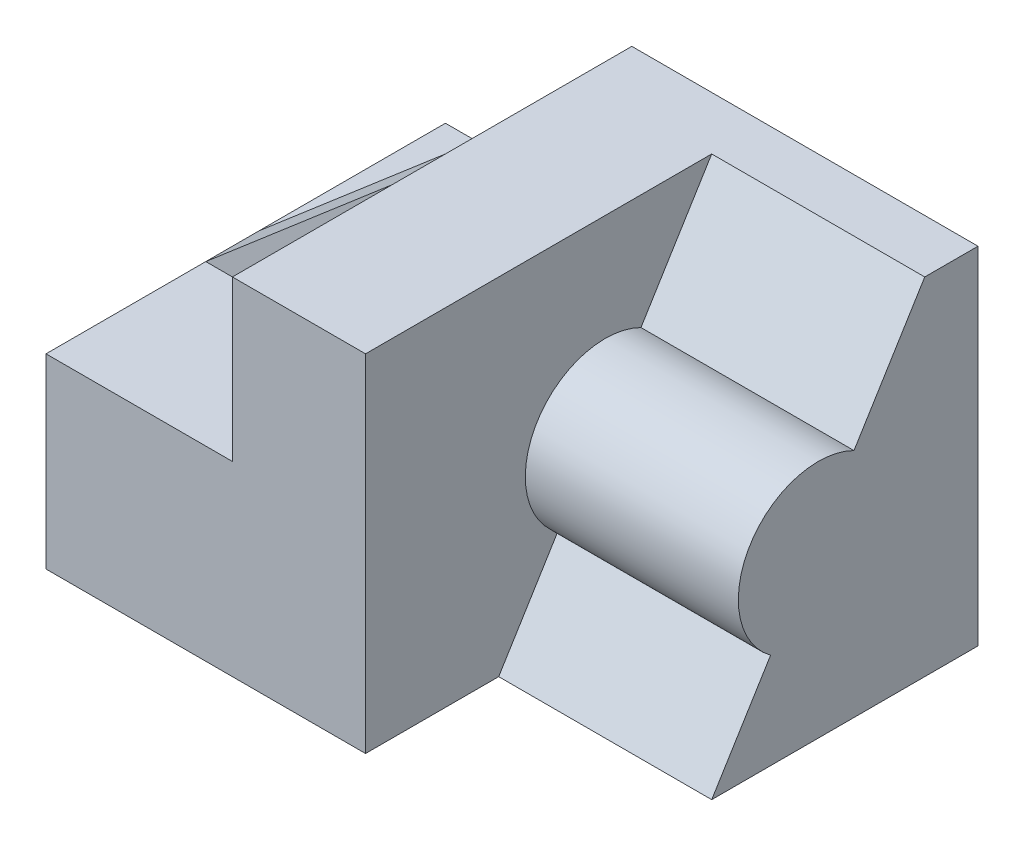
ISO-10303-21;
HEADER;
FILE_DESCRIPTION(('STEP AP214'),'2;1');
FILE_NAME('part.step','',(''),(''),'','','');
FILE_SCHEMA(('AUTOMOTIVE_DESIGN { 1 0 10303 214 1 1 1 1 }'));
ENDSEC;
DATA;
#1=APPLICATION_CONTEXT('core data for automotive mechanical design processes');
#2=APPLICATION_PROTOCOL_DEFINITION('international standard','automotive_design',2000,#1);
#3=PRODUCT_CONTEXT('',#1,'mechanical');
#4=PRODUCT('Part','Part','',(#3));
#5=PRODUCT_RELATED_PRODUCT_CATEGORY('part','',(#4));
#6=PRODUCT_DEFINITION_FORMATION('','',#4);
#7=PRODUCT_DEFINITION_CONTEXT('part definition',#1,'design');
#8=PRODUCT_DEFINITION('design','',#6,#7);
#9=PRODUCT_DEFINITION_SHAPE('','',#8);
#10=(LENGTH_UNIT() NAMED_UNIT(*) SI_UNIT(.MILLI.,.METRE.));
#11=(NAMED_UNIT(*) PLANE_ANGLE_UNIT() SI_UNIT($,.RADIAN.));
#12=(NAMED_UNIT(*) SI_UNIT($,.STERADIAN.) SOLID_ANGLE_UNIT());
#13=UNCERTAINTY_MEASURE_WITH_UNIT(LENGTH_MEASURE(1.E-05),#10,'distance_accuracy_value','');
#14=(GEOMETRIC_REPRESENTATION_CONTEXT(3) GLOBAL_UNCERTAINTY_ASSIGNED_CONTEXT((#13)) GLOBAL_UNIT_ASSIGNED_CONTEXT((#10,
#11,#12)) REPRESENTATION_CONTEXT('',''));
#15=CARTESIAN_POINT('',(0.,0.,0.));
#16=DIRECTION('',(0.,0.,1.));
#17=DIRECTION('',(1.,0.,0.));
#18=AXIS2_PLACEMENT_3D('',#15,#16,#17);
#19=CARTESIAN_POINT('',(-25.,35.,-75.));
#20=DIRECTION('',(0.,1.,0.));
#21=DIRECTION('',(0.,0.,1.));
#22=AXIS2_PLACEMENT_3D('',#19,#20,#21);
#23=PLANE('',#22);
#24=DIRECTION('',(0.,0.,1.));
#25=VECTOR('',#24,1.);
#26=CARTESIAN_POINT('',(-60.,35.,-75.));
#27=LINE('',#26,#25);
#28=CARTESIAN_POINT('',(-60.,35.,-75.));
#29=VERTEX_POINT('',#28);
#30=CARTESIAN_POINT('',(-60.,35.,-40.));
#31=VERTEX_POINT('',#30);
#32=EDGE_CURVE('E42',#29,#31,#27,.T.);
#33=ORIENTED_EDGE('',*,*,#32,.T.);
#34=DIRECTION('',(1.,0.,0.));
#35=VECTOR('',#34,1.);
#36=CARTESIAN_POINT('',(-60.,35.,-40.));
#37=LINE('',#36,#35);
#38=CARTESIAN_POINT('',(-25.,35.,-40.));
#39=VERTEX_POINT('',#38);
#40=EDGE_CURVE('E64',#31,#39,#37,.T.);
#41=ORIENTED_EDGE('',*,*,#40,.T.);
#42=DIRECTION('',(0.,0.,1.));
#43=VECTOR('',#42,1.);
#44=CARTESIAN_POINT('',(-25.,35.,-75.));
#45=LINE('',#44,#43);
#46=CARTESIAN_POINT('',(-25.,35.,-75.));
#47=VERTEX_POINT('',#46);
#48=EDGE_CURVE('E11',#47,#39,#45,.T.);
#49=ORIENTED_EDGE('',*,*,#48,.F.);
#50=DIRECTION('',(-1.,0.,0.));
#51=VECTOR('',#50,1.);
#52=CARTESIAN_POINT('',(-25.,35.,-75.));
#53=LINE('',#52,#51);
#54=EDGE_CURVE('E231',#47,#29,#53,.T.);
#55=ORIENTED_EDGE('',*,*,#54,.T.);
#56=EDGE_LOOP('',(#33,#41,#49,#55));
#57=FACE_BOUND('',#56,.T.);
#58=ADVANCED_FACE('F39',(#57),#23,.T.);
#59=CARTESIAN_POINT('',(-25.,35.,-30.));
#60=VERTEX_POINT('',#59);
#61=CARTESIAN_POINT('',(-25.,35.,0.));
#62=VERTEX_POINT('',#61);
#63=EDGE_CURVE('E48',#60,#62,#45,.T.);
#64=ORIENTED_EDGE('',*,*,#63,.F.);
#65=DIRECTION('',(1.,0.,0.));
#66=VECTOR('',#65,1.);
#67=CARTESIAN_POINT('',(-60.,35.,-30.));
#68=LINE('',#67,#66);
#69=CARTESIAN_POINT('',(-60.,35.,-30.));
#70=VERTEX_POINT('',#69);
#71=EDGE_CURVE('E169',#70,#60,#68,.T.);
#72=ORIENTED_EDGE('',*,*,#71,.F.);
#73=CARTESIAN_POINT('',(-60.,35.,0.));
#74=VERTEX_POINT('',#73);
#75=EDGE_CURVE('E249',#70,#74,#27,.T.);
#76=ORIENTED_EDGE('',*,*,#75,.T.);
#77=DIRECTION('',(-1.,0.,0.));
#78=VECTOR('',#77,1.);
#79=CARTESIAN_POINT('',(-25.,35.,0.));
#80=LINE('',#79,#78);
#81=EDGE_CURVE('E230',#62,#74,#80,.T.);
#82=ORIENTED_EDGE('',*,*,#81,.F.);
#83=EDGE_LOOP('',(#64,#72,#76,#82));
#84=FACE_BOUND('',#83,.T.);
#85=ADVANCED_FACE('F284',(#84),#23,.T.);
#86=CARTESIAN_POINT('',(-25.,65.,-75.));
#87=DIRECTION('',(-1.,0.,0.));
#88=DIRECTION('',(0.,-1.,0.));
#89=AXIS2_PLACEMENT_3D('',#86,#87,#88);
#90=PLANE('',#89);
#91=ORIENTED_EDGE('',*,*,#48,.T.);
#92=DIRECTION('',(0.,-1.,0.));
#93=VECTOR('',#92,1.);
#94=CARTESIAN_POINT('',(-25.,65.,-40.));
#95=LINE('',#94,#93);
#96=CARTESIAN_POINT('',(-25.,65.,-40.));
#97=VERTEX_POINT('',#96);
#98=EDGE_CURVE('E158',#97,#39,#95,.T.);
#99=ORIENTED_EDGE('',*,*,#98,.F.);
#100=DIRECTION('',(0.,0.,1.));
#101=VECTOR('',#100,1.);
#102=CARTESIAN_POINT('',(-25.,65.,-75.));
#103=LINE('',#102,#101);
#104=CARTESIAN_POINT('',(-25.,65.,-75.));
#105=VERTEX_POINT('',#104);
#106=EDGE_CURVE('E156',#105,#97,#103,.T.);
#107=ORIENTED_EDGE('',*,*,#106,.F.);
#108=DIRECTION('',(0.,-1.,0.));
#109=VECTOR('',#108,1.);
#110=CARTESIAN_POINT('',(-25.,65.,-75.));
#111=LINE('',#110,#109);
#112=EDGE_CURVE('E245',#105,#47,#111,.T.);
#113=ORIENTED_EDGE('',*,*,#112,.T.);
#114=EDGE_LOOP('',(#91,#99,#107,#113));
#115=FACE_BOUND('',#114,.T.);
#116=ADVANCED_FACE('F306',(#115),#90,.T.);
#117=CARTESIAN_POINT('',(-25.,65.,-30.));
#118=VERTEX_POINT('',#117);
#119=CARTESIAN_POINT('',(-25.,65.,0.));
#120=VERTEX_POINT('',#119);
#121=EDGE_CURVE('E153',#118,#120,#103,.T.);
#122=ORIENTED_EDGE('',*,*,#121,.F.);
#123=DIRECTION('',(0.,1.,0.));
#124=VECTOR('',#123,1.);
#125=CARTESIAN_POINT('',(-25.,35.,-30.));
#126=LINE('',#125,#124);
#127=EDGE_CURVE('E56',#60,#118,#126,.T.);
#128=ORIENTED_EDGE('',*,*,#127,.F.);
#129=ORIENTED_EDGE('',*,*,#63,.T.);
#130=DIRECTION('',(0.,-1.,0.));
#131=VECTOR('',#130,1.);
#132=CARTESIAN_POINT('',(-25.,65.,0.));
#133=LINE('',#132,#131);
#134=EDGE_CURVE('E163',#120,#62,#133,.T.);
#135=ORIENTED_EDGE('',*,*,#134,.F.);
#136=EDGE_LOOP('',(#122,#128,#129,#135));
#137=FACE_BOUND('',#136,.T.);
#138=ADVANCED_FACE('F161',(#137),#90,.T.);
#139=CARTESIAN_POINT('',(0.,65.,-75.));
#140=DIRECTION('',(0.,1.,0.));
#141=DIRECTION('',(0.,0.,1.));
#142=AXIS2_PLACEMENT_3D('',#139,#140,#141);
#143=PLANE('',#142);
#144=DIRECTION('',(0.,0.,1.));
#145=VECTOR('',#144,1.);
#146=CARTESIAN_POINT('',(-25.,65.,-75.001));
#147=LINE('',#146,#145);
#148=EDGE_CURVE('E139',#97,#118,#147,.T.);
#149=ORIENTED_EDGE('',*,*,#148,.T.);
#150=ORIENTED_EDGE('',*,*,#121,.T.);
#151=DIRECTION('',(-1.,0.,0.));
#152=VECTOR('',#151,1.);
#153=CARTESIAN_POINT('',(0.,65.,0.));
#154=LINE('',#153,#152);
#155=CARTESIAN_POINT('',(0.,65.,0.));
#156=VERTEX_POINT('',#155);
#157=EDGE_CURVE('E265',#156,#120,#154,.T.);
#158=ORIENTED_EDGE('',*,*,#157,.F.);
#159=DIRECTION('',(0.,0.,1.));
#160=VECTOR('',#159,1.);
#161=CARTESIAN_POINT('',(0.,65.,-75.));
#162=LINE('',#161,#160);
#163=CARTESIAN_POINT('',(0.,65.,-65.));
#164=VERTEX_POINT('',#163);
#165=EDGE_CURVE('E165',#164,#156,#162,.T.);
#166=ORIENTED_EDGE('',*,*,#165,.F.);
#167=DIRECTION('',(-1.,0.,0.));
#168=VECTOR('',#167,1.);
#169=CARTESIAN_POINT('',(40.,65.,-65.));
#170=LINE('',#169,#168);
#171=CARTESIAN_POINT('',(40.,65.,-65.));
#172=VERTEX_POINT('',#171);
#173=EDGE_CURVE('E226',#172,#164,#170,.T.);
#174=ORIENTED_EDGE('',*,*,#173,.F.);
#175=DIRECTION('',(0.,0.,1.));
#176=VECTOR('',#175,1.);
#177=CARTESIAN_POINT('',(40.,65.,-65.));
#178=LINE('',#177,#176);
#179=CARTESIAN_POINT('',(40.,65.,-75.));
#180=VERTEX_POINT('',#179);
#181=EDGE_CURVE('E182',#180,#172,#178,.T.);
#182=ORIENTED_EDGE('',*,*,#181,.F.);
#183=DIRECTION('',(-1.,0.,0.));
#184=VECTOR('',#183,1.);
#185=CARTESIAN_POINT('',(0.,65.,-75.));
#186=LINE('',#185,#184);
#187=EDGE_CURVE('E242',#180,#105,#186,.T.);
#188=ORIENTED_EDGE('',*,*,#187,.T.);
#189=ORIENTED_EDGE('',*,*,#106,.T.);
#190=EDGE_LOOP('',(#149,#150,#158,#166,#174,#182,#188,#189));
#191=FACE_BOUND('',#190,.T.);
#192=ADVANCED_FACE('F151',(#191),#143,.T.);
#193=CARTESIAN_POINT('',(0.,0.,-75.));
#194=DIRECTION('',(1.,0.,0.));
#195=DIRECTION('',(0.,0.,-1.));
#196=AXIS2_PLACEMENT_3D('',#193,#194,#195);
#197=PLANE('',#196);
#198=DIRECTION('',(0.,-0.851658316704544,0.524097425664335));
#199=VECTOR('',#198,1.);
#200=CARTESIAN_POINT('',(0.,17.9606496597904,-36.052707482948));
#201=LINE('',#200,#199);
#202=CARTESIAN_POINT('',(0.,17.9606496597904,-36.052707482948));
#203=VERTEX_POINT('',#202);
#204=CARTESIAN_POINT('',(0.,0.,-25.));
#205=VERTEX_POINT('',#204);
#206=EDGE_CURVE('E187',#203,#205,#201,.T.);
#207=ORIENTED_EDGE('',*,*,#206,.F.);
#208=CARTESIAN_POINT('',(0.,30.,-45.));
#209=DIRECTION('',(1.,0.,0.));
#210=DIRECTION('',(0.,0.,-1.));
#211=AXIS2_PLACEMENT_3D('',#208,#209,#210);
#212=CIRCLE('',#211,15.);
#213=CARTESIAN_POINT('',(0.,43.4127408981495,-51.7155328603997));
#214=VERTEX_POINT('',#213);
#215=EDGE_CURVE('E208',#214,#203,#212,.T.);
#216=ORIENTED_EDGE('',*,*,#215,.F.);
#217=DIRECTION('',(0.,-0.851658316704544,0.524097425664335));
#218=VECTOR('',#217,1.);
#219=CARTESIAN_POINT('',(0.,65.,-65.));
#220=LINE('',#219,#218);
#221=EDGE_CURVE('E181',#164,#214,#220,.T.);
#222=ORIENTED_EDGE('',*,*,#221,.F.);
#223=ORIENTED_EDGE('',*,*,#165,.T.);
#224=DIRECTION('',(0.,1.,0.));
#225=VECTOR('',#224,1.);
#226=CARTESIAN_POINT('',(0.,0.,0.));
#227=LINE('',#226,#225);
#228=CARTESIAN_POINT('',(0.,0.,0.));
#229=VERTEX_POINT('',#228);
#230=EDGE_CURVE('E261',#229,#156,#227,.T.);
#231=ORIENTED_EDGE('',*,*,#230,.F.);
#232=DIRECTION('',(0.,0.,1.));
#233=VECTOR('',#232,1.);
#234=CARTESIAN_POINT('',(0.,0.,-75.));
#235=LINE('',#234,#233);
#236=EDGE_CURVE('E273',#205,#229,#235,.T.);
#237=ORIENTED_EDGE('',*,*,#236,.F.);
#238=EDGE_LOOP('',(#207,#216,#222,#223,#231,#237));
#239=FACE_BOUND('',#238,.T.);
#240=ADVANCED_FACE('F330',(#239),#197,.T.);
#241=CARTESIAN_POINT('',(-60.,0.,-75.));
#242=DIRECTION('',(0.,-1.,0.));
#243=DIRECTION('',(0.,0.,-1.));
#244=AXIS2_PLACEMENT_3D('',#241,#242,#243);
#245=PLANE('',#244);
#246=DIRECTION('',(1.,0.,0.));
#247=VECTOR('',#246,1.);
#248=CARTESIAN_POINT('',(-60.,0.,0.));
#249=LINE('',#248,#247);
#250=CARTESIAN_POINT('',(-60.,0.,0.));
#251=VERTEX_POINT('',#250);
#252=EDGE_CURVE('E257',#251,#229,#249,.T.);
#253=ORIENTED_EDGE('',*,*,#252,.F.);
#254=DIRECTION('',(0.,0.,1.));
#255=VECTOR('',#254,1.);
#256=CARTESIAN_POINT('',(-60.,0.,-75.));
#257=LINE('',#256,#255);
#258=CARTESIAN_POINT('',(-60.,0.,-75.));
#259=VERTEX_POINT('',#258);
#260=EDGE_CURVE('E275',#259,#251,#257,.T.);
#261=ORIENTED_EDGE('',*,*,#260,.F.);
#262=DIRECTION('',(1.,0.,0.));
#263=VECTOR('',#262,1.);
#264=CARTESIAN_POINT('',(-60.,0.,-75.));
#265=LINE('',#264,#263);
#266=CARTESIAN_POINT('',(40.,0.,-75.));
#267=VERTEX_POINT('',#266);
#268=EDGE_CURVE('E239',#259,#267,#265,.T.);
#269=ORIENTED_EDGE('',*,*,#268,.T.);
#270=DIRECTION('',(0.,0.,-1.));
#271=VECTOR('',#270,1.);
#272=CARTESIAN_POINT('',(40.,0.,-75.));
#273=LINE('',#272,#271);
#274=CARTESIAN_POINT('',(40.,0.,-25.));
#275=VERTEX_POINT('',#274);
#276=EDGE_CURVE('E196',#275,#267,#273,.T.);
#277=ORIENTED_EDGE('',*,*,#276,.F.);
#278=DIRECTION('',(-1.,0.,0.));
#279=VECTOR('',#278,1.);
#280=CARTESIAN_POINT('',(40.,0.,-25.));
#281=LINE('',#280,#279);
#282=EDGE_CURVE('E204',#275,#205,#281,.T.);
#283=ORIENTED_EDGE('',*,*,#282,.T.);
#284=ORIENTED_EDGE('',*,*,#236,.T.);
#285=EDGE_LOOP('',(#253,#261,#269,#277,#283,#284));
#286=FACE_BOUND('',#285,.T.);
#287=ADVANCED_FACE('F333',(#286),#245,.T.);
#288=CARTESIAN_POINT('',(-60.,35.,-75.));
#289=DIRECTION('',(-1.,0.,0.));
#290=DIRECTION('',(0.,0.,1.));
#291=AXIS2_PLACEMENT_3D('',#288,#289,#290);
#292=PLANE('',#291);
#293=DIRECTION('',(0.,0.,1.));
#294=VECTOR('',#293,1.);
#295=CARTESIAN_POINT('',(-60.,35.,-75.001));
#296=LINE('',#295,#294);
#297=EDGE_CURVE('E142',#31,#70,#296,.T.);
#298=ORIENTED_EDGE('',*,*,#297,.F.);
#299=ORIENTED_EDGE('',*,*,#32,.F.);
#300=DIRECTION('',(0.,-1.,0.));
#301=VECTOR('',#300,1.);
#302=CARTESIAN_POINT('',(-60.,35.,-75.));
#303=LINE('',#302,#301);
#304=EDGE_CURVE('E235',#29,#259,#303,.T.);
#305=ORIENTED_EDGE('',*,*,#304,.T.);
#306=ORIENTED_EDGE('',*,*,#260,.T.);
#307=DIRECTION('',(0.,-1.,0.));
#308=VECTOR('',#307,1.);
#309=CARTESIAN_POINT('',(-60.,35.,0.));
#310=LINE('',#309,#308);
#311=EDGE_CURVE('E253',#74,#251,#310,.T.);
#312=ORIENTED_EDGE('',*,*,#311,.F.);
#313=ORIENTED_EDGE('',*,*,#75,.F.);
#314=EDGE_LOOP('',(#298,#299,#305,#306,#312,#313));
#315=FACE_BOUND('',#314,.T.);
#316=ADVANCED_FACE('F285',(#315),#292,.T.);
#317=CARTESIAN_POINT('',(0.,0.,-75.));
#318=DIRECTION('',(0.,0.,1.));
#319=DIRECTION('',(1.,0.,0.));
#320=AXIS2_PLACEMENT_3D('',#317,#318,#319);
#321=PLANE('',#320);
#322=ORIENTED_EDGE('',*,*,#54,.F.);
#323=ORIENTED_EDGE('',*,*,#112,.F.);
#324=ORIENTED_EDGE('',*,*,#187,.F.);
#325=DIRECTION('',(0.,1.,0.));
#326=VECTOR('',#325,1.);
#327=CARTESIAN_POINT('',(40.,65.,-75.));
#328=LINE('',#327,#326);
#329=EDGE_CURVE('E200',#267,#180,#328,.T.);
#330=ORIENTED_EDGE('',*,*,#329,.F.);
#331=ORIENTED_EDGE('',*,*,#268,.F.);
#332=ORIENTED_EDGE('',*,*,#304,.F.);
#333=EDGE_LOOP('',(#322,#323,#324,#330,#331,#332));
#334=FACE_BOUND('',#333,.T.);
#335=ADVANCED_FACE('F303',(#334),#321,.F.);
#336=CARTESIAN_POINT('',(0.,0.,0.));
#337=DIRECTION('',(0.,0.,1.));
#338=DIRECTION('',(1.,0.,0.));
#339=AXIS2_PLACEMENT_3D('',#336,#337,#338);
#340=PLANE('',#339);
#341=ORIENTED_EDGE('',*,*,#81,.T.);
#342=ORIENTED_EDGE('',*,*,#311,.T.);
#343=ORIENTED_EDGE('',*,*,#252,.T.);
#344=ORIENTED_EDGE('',*,*,#230,.T.);
#345=ORIENTED_EDGE('',*,*,#157,.T.);
#346=ORIENTED_EDGE('',*,*,#134,.T.);
#347=EDGE_LOOP('',(#341,#342,#343,#344,#345,#346));
#348=FACE_BOUND('',#347,.T.);
#349=ADVANCED_FACE('F287',(#348),#340,.T.);
#350=CARTESIAN_POINT('',(40.,65.,-65.));
#351=DIRECTION('',(0.,-0.524097425664335,-0.851658316704544));
#352=DIRECTION('',(0.,0.851658316704544,-0.524097425664335));
#353=AXIS2_PLACEMENT_3D('',#350,#351,#352);
#354=PLANE('',#353);
#355=ORIENTED_EDGE('',*,*,#221,.T.);
#356=DIRECTION('',(-1.,0.,0.));
#357=VECTOR('',#356,1.);
#358=CARTESIAN_POINT('',(40.,43.4127408981495,-51.7155328603997));
#359=LINE('',#358,#357);
#360=CARTESIAN_POINT('',(40.,43.4127408981495,-51.7155328603997));
#361=VERTEX_POINT('',#360);
#362=EDGE_CURVE('E222',#361,#214,#359,.T.);
#363=ORIENTED_EDGE('',*,*,#362,.F.);
#364=DIRECTION('',(0.,-0.851658316704544,0.524097425664335));
#365=VECTOR('',#364,1.);
#366=CARTESIAN_POINT('',(40.,65.,-65.));
#367=LINE('',#366,#365);
#368=EDGE_CURVE('E186',#172,#361,#367,.T.);
#369=ORIENTED_EDGE('',*,*,#368,.F.);
#370=ORIENTED_EDGE('',*,*,#173,.T.);
#371=EDGE_LOOP('',(#355,#363,#369,#370));
#372=FACE_BOUND('',#371,.T.);
#373=ADVANCED_FACE('F294',(#372),#354,.F.);
#374=CARTESIAN_POINT('',(40.,30.,-45.));
#375=DIRECTION('',(-1.,0.,0.));
#376=DIRECTION('',(0.,0.,1.));
#377=AXIS2_PLACEMENT_3D('',#374,#375,#376);
#378=CYLINDRICAL_SURFACE('',#377,15.);
#379=ORIENTED_EDGE('',*,*,#215,.T.);
#380=DIRECTION('',(-1.,0.,0.));
#381=VECTOR('',#380,1.);
#382=CARTESIAN_POINT('',(40.,17.9606496597904,-36.052707482948));
#383=LINE('',#382,#381);
#384=CARTESIAN_POINT('',(40.,17.9606496597904,-36.052707482948));
#385=VERTEX_POINT('',#384);
#386=EDGE_CURVE('E218',#385,#203,#383,.T.);
#387=ORIENTED_EDGE('',*,*,#386,.F.);
#388=CARTESIAN_POINT('',(40.,30.,-45.));
#389=DIRECTION('',(1.,0.,0.));
#390=DIRECTION('',(0.,0.,-1.));
#391=AXIS2_PLACEMENT_3D('',#388,#389,#390);
#392=CIRCLE('',#391,15.);
#393=EDGE_CURVE('E190',#361,#385,#392,.T.);
#394=ORIENTED_EDGE('',*,*,#393,.F.);
#395=ORIENTED_EDGE('',*,*,#362,.T.);
#396=EDGE_LOOP('',(#379,#387,#394,#395));
#397=FACE_BOUND('',#396,.T.);
#398=ADVANCED_FACE('F346',(#397),#378,.T.);
#399=CARTESIAN_POINT('',(40.,17.9606496597904,-36.052707482948));
#400=DIRECTION('',(0.,-0.524097425664335,-0.851658316704544));
#401=DIRECTION('',(0.,0.851658316704544,-0.524097425664335));
#402=AXIS2_PLACEMENT_3D('',#399,#400,#401);
#403=PLANE('',#402);
#404=ORIENTED_EDGE('',*,*,#206,.T.);
#405=ORIENTED_EDGE('',*,*,#282,.F.);
#406=DIRECTION('',(0.,-0.851658316704544,0.524097425664335));
#407=VECTOR('',#406,1.);
#408=CARTESIAN_POINT('',(40.,17.9606496597904,-36.052707482948));
#409=LINE('',#408,#407);
#410=EDGE_CURVE('E193',#385,#275,#409,.T.);
#411=ORIENTED_EDGE('',*,*,#410,.F.);
#412=ORIENTED_EDGE('',*,*,#386,.T.);
#413=EDGE_LOOP('',(#404,#405,#411,#412));
#414=FACE_BOUND('',#413,.T.);
#415=ADVANCED_FACE('F349',(#414),#403,.F.);
#416=CARTESIAN_POINT('',(40.,30.,-45.));
#417=DIRECTION('',(1.,0.,0.));
#418=DIRECTION('',(0.,0.,-1.));
#419=AXIS2_PLACEMENT_3D('',#416,#417,#418);
#420=PLANE('',#419);
#421=ORIENTED_EDGE('',*,*,#181,.T.);
#422=ORIENTED_EDGE('',*,*,#368,.T.);
#423=ORIENTED_EDGE('',*,*,#393,.T.);
#424=ORIENTED_EDGE('',*,*,#410,.T.);
#425=ORIENTED_EDGE('',*,*,#276,.T.);
#426=ORIENTED_EDGE('',*,*,#329,.T.);
#427=EDGE_LOOP('',(#421,#422,#423,#424,#425,#426));
#428=FACE_BOUND('',#427,.T.);
#429=ADVANCED_FACE('F298',(#428),#420,.T.);
#430=CARTESIAN_POINT('',(-60.,65.,-40.));
#431=DIRECTION('',(0.,0.,1.));
#432=DIRECTION('',(0.,-1.,0.));
#433=AXIS2_PLACEMENT_3D('',#430,#431,#432);
#434=PLANE('',#433);
#435=ORIENTED_EDGE('',*,*,#40,.F.);
#436=DIRECTION('',(-0.759256602365297,-0.650791373455968,0.));
#437=VECTOR('',#436,1.);
#438=CARTESIAN_POINT('',(-25.,65.,-40.));
#439=LINE('',#438,#437);
#440=EDGE_CURVE('E147',#97,#31,#439,.T.);
#441=ORIENTED_EDGE('',*,*,#440,.F.);
#442=ORIENTED_EDGE('',*,*,#98,.T.);
#443=EDGE_LOOP('',(#435,#441,#442));
#444=FACE_BOUND('',#443,.T.);
#445=ADVANCED_FACE('F309',(#444),#434,.F.);
#446=CARTESIAN_POINT('',(-60.,35.,-30.));
#447=DIRECTION('',(0.,0.,-1.));
#448=DIRECTION('',(-1.,0.,0.));
#449=AXIS2_PLACEMENT_3D('',#446,#447,#448);
#450=PLANE('',#449);
#451=ORIENTED_EDGE('',*,*,#127,.T.);
#452=DIRECTION('',(0.759256602365297,0.650791373455968,0.));
#453=VECTOR('',#452,1.);
#454=CARTESIAN_POINT('',(-25.,65.,-30.));
#455=LINE('',#454,#453);
#456=EDGE_CURVE('E136',#70,#118,#455,.T.);
#457=ORIENTED_EDGE('',*,*,#456,.F.);
#458=ORIENTED_EDGE('',*,*,#71,.T.);
#459=EDGE_LOOP('',(#451,#457,#458));
#460=FACE_BOUND('',#459,.T.);
#461=ADVANCED_FACE('F167',(#460),#450,.F.);
#462=CARTESIAN_POINT('',(-25.,65.,-75.001));
#463=DIRECTION('',(0.650791373455968,-0.759256602365297,0.));
#464=DIRECTION('',(0.759256602365297,0.650791373455968,0.));
#465=AXIS2_PLACEMENT_3D('',#462,#463,#464);
#466=PLANE('',#465);
#467=ORIENTED_EDGE('',*,*,#440,.T.);
#468=ORIENTED_EDGE('',*,*,#297,.T.);
#469=ORIENTED_EDGE('',*,*,#456,.T.);
#470=ORIENTED_EDGE('',*,*,#148,.F.);
#471=EDGE_LOOP('',(#467,#468,#469,#470));
#472=FACE_BOUND('',#471,.T.);
#473=ADVANCED_FACE('F138',(#472),#466,.F.);
#474=CLOSED_SHELL('',(#58,#85,#116,#138,#192,#240,#287,#316,#335,#349,#373,#398,#415,#429,#445,
#461,#473));
#475=MANIFOLD_SOLID_BREP('B2',#474);
#476=ADVANCED_BREP_SHAPE_REPRESENTATION('',(#18,#475),#14);
#477=SHAPE_DEFINITION_REPRESENTATION(#9,#476);
ENDSEC;
END-ISO-10303-21;
